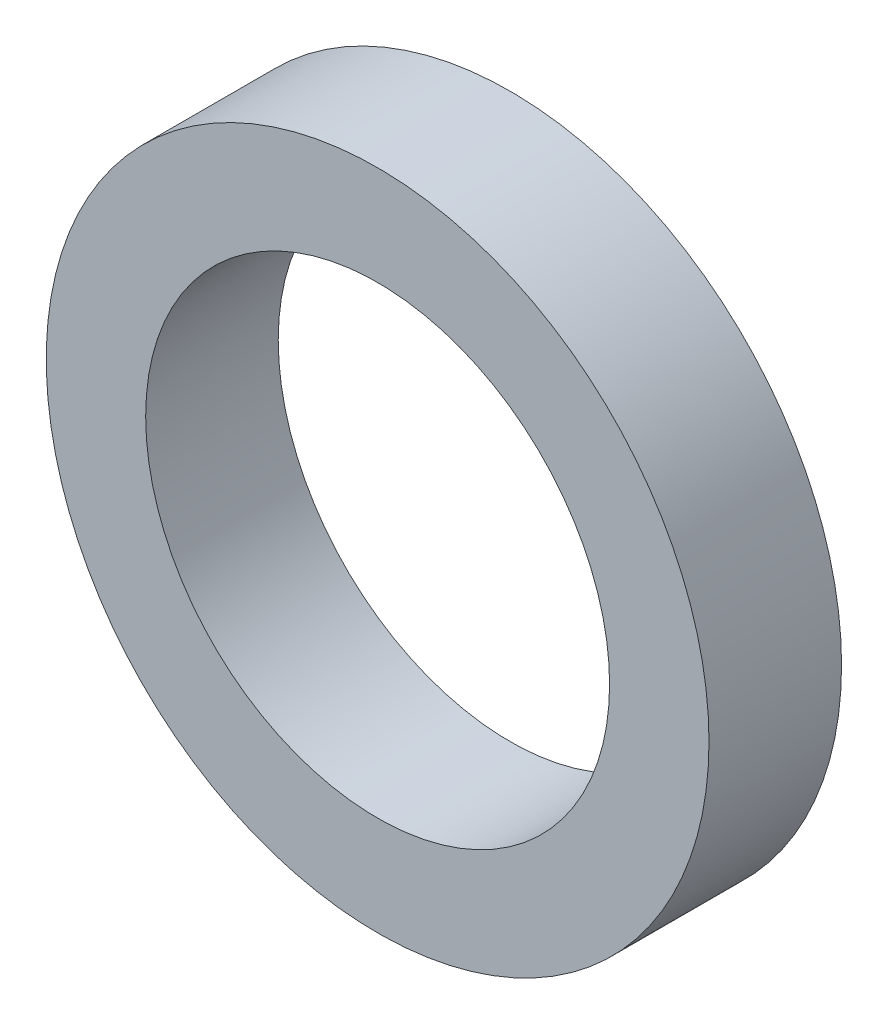
ISO-10303-21;
HEADER;
FILE_DESCRIPTION(('STEP AP214'),'2;1');
FILE_NAME('part.step','',(''),(''),'','','');
FILE_SCHEMA(('AUTOMOTIVE_DESIGN { 1 0 10303 214 1 1 1 1 }'));
ENDSEC;
DATA;
#1=APPLICATION_CONTEXT('core data for automotive mechanical design processes');
#2=APPLICATION_PROTOCOL_DEFINITION('international standard','automotive_design',2000,#1);
#3=PRODUCT_CONTEXT('',#1,'mechanical');
#4=PRODUCT('Part','Part','',(#3));
#5=PRODUCT_RELATED_PRODUCT_CATEGORY('part','',(#4));
#6=PRODUCT_DEFINITION_FORMATION('','',#4);
#7=PRODUCT_DEFINITION_CONTEXT('part definition',#1,'design');
#8=PRODUCT_DEFINITION('design','',#6,#7);
#9=PRODUCT_DEFINITION_SHAPE('','',#8);
#10=(LENGTH_UNIT() NAMED_UNIT(*) SI_UNIT(.MILLI.,.METRE.));
#11=(NAMED_UNIT(*) PLANE_ANGLE_UNIT() SI_UNIT($,.RADIAN.));
#12=(NAMED_UNIT(*) SI_UNIT($,.STERADIAN.) SOLID_ANGLE_UNIT());
#13=UNCERTAINTY_MEASURE_WITH_UNIT(LENGTH_MEASURE(1.E-05),#10,'distance_accuracy_value','');
#14=(GEOMETRIC_REPRESENTATION_CONTEXT(3) GLOBAL_UNCERTAINTY_ASSIGNED_CONTEXT((#13)) GLOBAL_UNIT_ASSIGNED_CONTEXT((#10,
#11,#12)) REPRESENTATION_CONTEXT('',''));
#15=CARTESIAN_POINT('',(0.,0.,0.));
#16=DIRECTION('',(0.,0.,1.));
#17=DIRECTION('',(1.,0.,0.));
#18=AXIS2_PLACEMENT_3D('',#15,#16,#17);
#19=CARTESIAN_POINT('',(0.,0.,8.));
#20=DIRECTION('',(0.,0.,1.));
#21=DIRECTION('',(1.,0.,0.));
#22=AXIS2_PLACEMENT_3D('',#19,#20,#21);
#23=PLANE('',#22);
#24=CARTESIAN_POINT('',(0.,0.,8.));
#25=DIRECTION('',(0.,0.,1.));
#26=DIRECTION('',(1.,0.,0.));
#27=AXIS2_PLACEMENT_3D('',#24,#25,#26);
#28=CIRCLE('',#27,20.);
#29=CARTESIAN_POINT('',(20.,0.,8.));
#30=VERTEX_POINT('',#29);
#31=EDGE_CURVE('E10',#30,#30,#28,.T.);
#32=ORIENTED_EDGE('',*,*,#31,.T.);
#33=EDGE_LOOP('',(#32));
#34=FACE_BOUND('',#33,.T.);
#35=CARTESIAN_POINT('',(0.,0.,8.));
#36=DIRECTION('',(0.,0.,1.));
#37=DIRECTION('',(1.,0.,0.));
#38=AXIS2_PLACEMENT_3D('',#35,#36,#37);
#39=CIRCLE('',#38,14.);
#40=CARTESIAN_POINT('',(14.,0.,8.));
#41=VERTEX_POINT('',#40);
#42=EDGE_CURVE('E56',#41,#41,#39,.T.);
#43=ORIENTED_EDGE('',*,*,#42,.F.);
#44=EDGE_LOOP('',(#43));
#45=FACE_BOUND('',#44,.T.);
#46=ADVANCED_FACE('F43',(#34,#45),#23,.T.);
#47=CARTESIAN_POINT('',(0.,0.,0.));
#48=DIRECTION('',(0.,0.,1.));
#49=DIRECTION('',(1.,0.,0.));
#50=AXIS2_PLACEMENT_3D('',#47,#48,#49);
#51=PLANE('',#50);
#52=CARTESIAN_POINT('',(0.,0.,0.));
#53=DIRECTION('',(0.,0.,1.));
#54=DIRECTION('',(1.,0.,0.));
#55=AXIS2_PLACEMENT_3D('',#52,#53,#54);
#56=CIRCLE('',#55,20.);
#57=CARTESIAN_POINT('',(20.,0.,0.));
#58=VERTEX_POINT('',#57);
#59=EDGE_CURVE('E47',#58,#58,#56,.T.);
#60=ORIENTED_EDGE('',*,*,#59,.F.);
#61=EDGE_LOOP('',(#60));
#62=FACE_BOUND('',#61,.T.);
#63=CARTESIAN_POINT('',(0.,0.,0.));
#64=DIRECTION('',(0.,0.,1.));
#65=DIRECTION('',(1.,0.,0.));
#66=AXIS2_PLACEMENT_3D('',#63,#64,#65);
#67=CIRCLE('',#66,14.);
#68=CARTESIAN_POINT('',(14.,0.,0.));
#69=VERTEX_POINT('',#68);
#70=EDGE_CURVE('E58',#69,#69,#67,.T.);
#71=ORIENTED_EDGE('',*,*,#70,.T.);
#72=EDGE_LOOP('',(#71));
#73=FACE_BOUND('',#72,.T.);
#74=ADVANCED_FACE('F70',(#62,#73),#51,.F.);
#75=CARTESIAN_POINT('',(0.,0.,8.));
#76=DIRECTION('',(0.,0.,-1.));
#77=DIRECTION('',(-1.,0.,0.));
#78=AXIS2_PLACEMENT_3D('',#75,#76,#77);
#79=CYLINDRICAL_SURFACE('',#78,20.);
#80=ORIENTED_EDGE('',*,*,#31,.F.);
#81=EDGE_LOOP('',(#80));
#82=FACE_BOUND('',#81,.T.);
#83=ORIENTED_EDGE('',*,*,#59,.T.);
#84=EDGE_LOOP('',(#83));
#85=FACE_BOUND('',#84,.T.);
#86=ADVANCED_FACE('F45',(#82,#85),#79,.T.);
#87=CARTESIAN_POINT('',(0.,0.,8.));
#88=DIRECTION('',(0.,0.,-1.));
#89=DIRECTION('',(-1.,0.,0.));
#90=AXIS2_PLACEMENT_3D('',#87,#88,#89);
#91=CYLINDRICAL_SURFACE('',#90,14.);
#92=ORIENTED_EDGE('',*,*,#42,.T.);
#93=EDGE_LOOP('',(#92));
#94=FACE_BOUND('',#93,.T.);
#95=ORIENTED_EDGE('',*,*,#70,.F.);
#96=EDGE_LOOP('',(#95));
#97=FACE_BOUND('',#96,.T.);
#98=ADVANCED_FACE('F66',(#94,#97),#91,.F.);
#99=CLOSED_SHELL('',(#46,#74,#86,#98));
#100=MANIFOLD_SOLID_BREP('B2',#99);
#101=ADVANCED_BREP_SHAPE_REPRESENTATION('',(#18,#100),#14);
#102=SHAPE_DEFINITION_REPRESENTATION(#9,#101);
ENDSEC;
END-ISO-10303-21;
